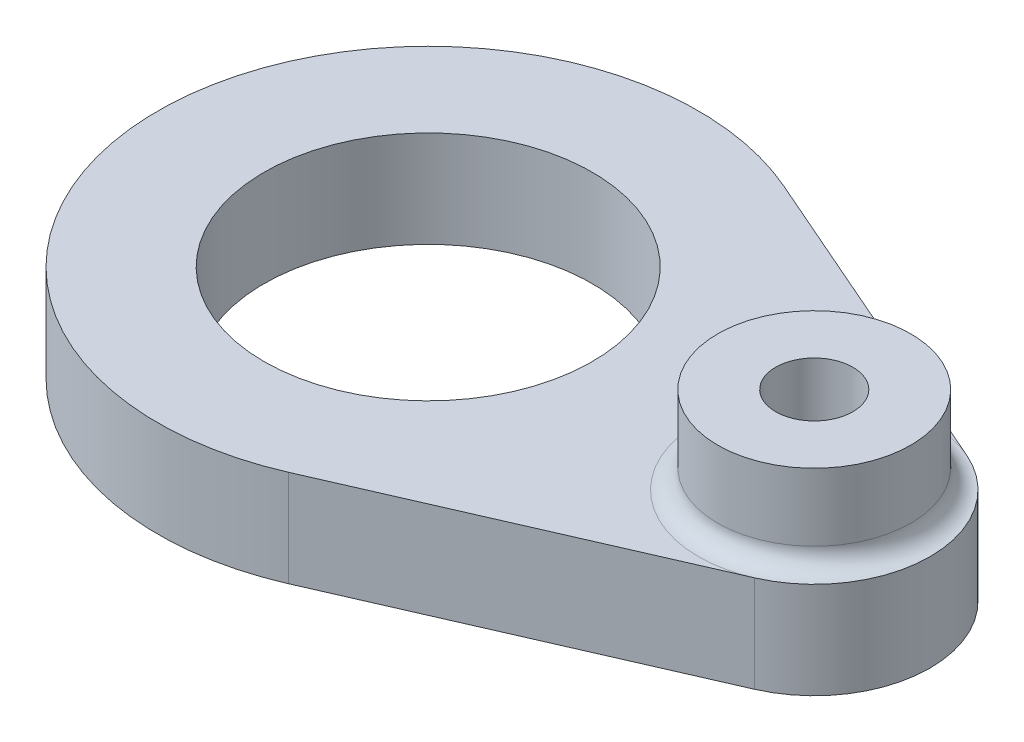
ISO-10303-21;
HEADER;
FILE_DESCRIPTION(('STEP AP214'),'2;1');
FILE_NAME('part.step','',(''),(''),'','','');
FILE_SCHEMA(('AUTOMOTIVE_DESIGN { 1 0 10303 214 1 1 1 1 }'));
ENDSEC;
DATA;
#1=APPLICATION_CONTEXT('core data for automotive mechanical design processes');
#2=APPLICATION_PROTOCOL_DEFINITION('international standard','automotive_design',2000,#1);
#3=PRODUCT_CONTEXT('',#1,'mechanical');
#4=PRODUCT('Part','Part','',(#3));
#5=PRODUCT_RELATED_PRODUCT_CATEGORY('part','',(#4));
#6=PRODUCT_DEFINITION_FORMATION('','',#4);
#7=PRODUCT_DEFINITION_CONTEXT('part definition',#1,'design');
#8=PRODUCT_DEFINITION('design','',#6,#7);
#9=PRODUCT_DEFINITION_SHAPE('','',#8);
#10=(LENGTH_UNIT() NAMED_UNIT(*) SI_UNIT(.MILLI.,.METRE.));
#11=(NAMED_UNIT(*) PLANE_ANGLE_UNIT() SI_UNIT($,.RADIAN.));
#12=(NAMED_UNIT(*) SI_UNIT($,.STERADIAN.) SOLID_ANGLE_UNIT());
#13=UNCERTAINTY_MEASURE_WITH_UNIT(LENGTH_MEASURE(1.E-05),#10,'distance_accuracy_value','');
#14=(GEOMETRIC_REPRESENTATION_CONTEXT(3) GLOBAL_UNCERTAINTY_ASSIGNED_CONTEXT((#13)) GLOBAL_UNIT_ASSIGNED_CONTEXT((#10,
#11,#12)) REPRESENTATION_CONTEXT('',''));
#15=CARTESIAN_POINT('',(0.,0.,0.));
#16=DIRECTION('',(0.,0.,1.));
#17=DIRECTION('',(1.,0.,0.));
#18=AXIS2_PLACEMENT_3D('',#15,#16,#17);
#19=CARTESIAN_POINT('',(0.,2.5,0.));
#20=DIRECTION('',(0.,1.,0.));
#21=DIRECTION('',(0.,0.,1.));
#22=AXIS2_PLACEMENT_3D('',#19,#20,#21);
#23=PLANE('',#22);
#24=DIRECTION('',(0.916515138991168,0.,-0.4));
#25=VECTOR('',#24,1.);
#26=CARTESIAN_POINT('',(2.8,2.5,6.41560597293818));
#27=LINE('',#26,#25);
#28=CARTESIAN_POINT('',(2.8,2.5,6.41560597293818));
#29=VERTEX_POINT('',#28);
#30=CARTESIAN_POINT('',(11.2,2.5,2.7495454169735));
#31=VERTEX_POINT('',#30);
#32=EDGE_CURVE('E85',#29,#31,#27,.T.);
#33=ORIENTED_EDGE('',*,*,#32,.T.);
#34=CARTESIAN_POINT('',(10.,2.5,0.));
#35=DIRECTION('',(0.,1.,0.));
#36=DIRECTION('',(0.,0.,1.));
#37=AXIS2_PLACEMENT_3D('',#34,#35,#36);
#38=CIRCLE('',#37,3.);
#39=CARTESIAN_POINT('',(11.2,2.5,-2.7495454169735));
#40=VERTEX_POINT('',#39);
#41=EDGE_CURVE('E11',#31,#40,#38,.F.);
#42=ORIENTED_EDGE('',*,*,#41,.T.);
#43=DIRECTION('',(0.916515138991168,0.,0.4));
#44=VECTOR('',#43,1.);
#45=CARTESIAN_POINT('',(2.8,2.5,-6.41560597293817));
#46=LINE('',#45,#44);
#47=CARTESIAN_POINT('',(2.8,2.5,-6.41560597293818));
#48=VERTEX_POINT('',#47);
#49=EDGE_CURVE('E108',#48,#40,#46,.T.);
#50=ORIENTED_EDGE('',*,*,#49,.F.);
#51=CARTESIAN_POINT('',(0.,2.5,0.));
#52=DIRECTION('',(0.,1.,0.));
#53=DIRECTION('',(0.,0.,1.));
#54=AXIS2_PLACEMENT_3D('',#51,#52,#53);
#55=CIRCLE('',#54,7.);
#56=EDGE_CURVE('E96',#48,#29,#55,.T.);
#57=ORIENTED_EDGE('',*,*,#56,.T.);
#58=EDGE_LOOP('',(#33,#42,#50,#57));
#59=FACE_BOUND('',#58,.T.);
#60=CARTESIAN_POINT('',(0.,2.5,0.));
#61=DIRECTION('',(0.,1.,0.));
#62=DIRECTION('',(0.,0.,1.));
#63=AXIS2_PLACEMENT_3D('',#60,#61,#62);
#64=CIRCLE('',#63,4.25);
#65=CARTESIAN_POINT('',(0.,2.5,4.25));
#66=VERTEX_POINT('',#65);
#67=EDGE_CURVE('E128',#66,#66,#64,.T.);
#68=ORIENTED_EDGE('',*,*,#67,.F.);
#69=EDGE_LOOP('',(#68));
#70=FACE_BOUND('',#69,.T.);
#71=ADVANCED_FACE('F42',(#59,#70),#23,.T.);
#72=CARTESIAN_POINT('',(0.,2.5,0.));
#73=DIRECTION('',(0.,-1.,0.));
#74=DIRECTION('',(0.,0.,-1.));
#75=AXIS2_PLACEMENT_3D('',#72,#73,#74);
#76=CYLINDRICAL_SURFACE('',#75,7.);
#77=CARTESIAN_POINT('',(0.,0.,0.));
#78=DIRECTION('',(0.,1.,0.));
#79=DIRECTION('',(0.,0.,1.));
#80=AXIS2_PLACEMENT_3D('',#77,#78,#79);
#81=CIRCLE('',#80,7.);
#82=CARTESIAN_POINT('',(2.8,0.,-6.41560597293818));
#83=VERTEX_POINT('',#82);
#84=CARTESIAN_POINT('',(2.8,0.,6.41560597293818));
#85=VERTEX_POINT('',#84);
#86=EDGE_CURVE('E116',#83,#85,#81,.T.);
#87=ORIENTED_EDGE('',*,*,#86,.T.);
#88=DIRECTION('',(0.,-1.,0.));
#89=VECTOR('',#88,1.);
#90=CARTESIAN_POINT('',(2.8,2.5,6.41560597293818));
#91=LINE('',#90,#89);
#92=EDGE_CURVE('E105',#29,#85,#91,.T.);
#93=ORIENTED_EDGE('',*,*,#92,.F.);
#94=ORIENTED_EDGE('',*,*,#56,.F.);
#95=DIRECTION('',(0.,-1.,0.));
#96=VECTOR('',#95,1.);
#97=CARTESIAN_POINT('',(2.8,2.5,-6.41560597293818));
#98=LINE('',#97,#96);
#99=EDGE_CURVE('E59',#48,#83,#98,.T.);
#100=ORIENTED_EDGE('',*,*,#99,.T.);
#101=EDGE_LOOP('',(#87,#93,#94,#100));
#102=FACE_BOUND('',#101,.T.);
#103=ADVANCED_FACE('F143',(#102),#76,.T.);
#104=CARTESIAN_POINT('',(2.8,2.5,6.41560597293818));
#105=DIRECTION('',(-0.4,0.,-0.916515138991168));
#106=DIRECTION('',(-0.916515138991168,0.,0.4));
#107=AXIS2_PLACEMENT_3D('',#104,#105,#106);
#108=PLANE('',#107);
#109=DIRECTION('',(0.916515138991168,0.,-0.4));
#110=VECTOR('',#109,1.);
#111=CARTESIAN_POINT('',(2.8,0.,6.41560597293818));
#112=LINE('',#111,#110);
#113=CARTESIAN_POINT('',(11.2,0.,2.7495454169735));
#114=VERTEX_POINT('',#113);
#115=EDGE_CURVE('E102',#85,#114,#112,.T.);
#116=ORIENTED_EDGE('',*,*,#115,.T.);
#117=DIRECTION('',(0.,-1.,0.));
#118=VECTOR('',#117,1.);
#119=CARTESIAN_POINT('',(11.2,2.5,2.7495454169735));
#120=LINE('',#119,#118);
#121=EDGE_CURVE('E100',#31,#114,#120,.T.);
#122=ORIENTED_EDGE('',*,*,#121,.F.);
#123=ORIENTED_EDGE('',*,*,#32,.F.);
#124=ORIENTED_EDGE('',*,*,#92,.T.);
#125=EDGE_LOOP('',(#116,#122,#123,#124));
#126=FACE_BOUND('',#125,.T.);
#127=ADVANCED_FACE('F101',(#126),#108,.F.);
#128=CARTESIAN_POINT('',(10.,2.5,0.));
#129=DIRECTION('',(0.,-1.,0.));
#130=DIRECTION('',(0.,0.,-1.));
#131=AXIS2_PLACEMENT_3D('',#128,#129,#130);
#132=CYLINDRICAL_SURFACE('',#131,3.);
#133=CARTESIAN_POINT('',(10.,0.,0.));
#134=DIRECTION('',(0.,1.,0.));
#135=DIRECTION('',(0.,0.,1.));
#136=AXIS2_PLACEMENT_3D('',#133,#134,#135);
#137=CIRCLE('',#136,3.);
#138=CARTESIAN_POINT('',(11.2,0.,-2.7495454169735));
#139=VERTEX_POINT('',#138);
#140=EDGE_CURVE('E120',#114,#139,#137,.T.);
#141=ORIENTED_EDGE('',*,*,#140,.T.);
#142=DIRECTION('',(0.,-1.,0.));
#143=VECTOR('',#142,1.);
#144=CARTESIAN_POINT('',(11.2,2.5,-2.7495454169735));
#145=LINE('',#144,#143);
#146=EDGE_CURVE('E73',#40,#139,#145,.T.);
#147=ORIENTED_EDGE('',*,*,#146,.F.);
#148=CARTESIAN_POINT('',(10.,2.5,0.));
#149=DIRECTION('',(0.,1.,0.));
#150=DIRECTION('',(0.,0.,1.));
#151=AXIS2_PLACEMENT_3D('',#148,#149,#150);
#152=CIRCLE('',#151,3.);
#153=EDGE_CURVE('E92',#31,#40,#152,.T.);
#154=ORIENTED_EDGE('',*,*,#153,.F.);
#155=ORIENTED_EDGE('',*,*,#121,.T.);
#156=EDGE_LOOP('',(#141,#147,#154,#155));
#157=FACE_BOUND('',#156,.T.);
#158=ADVANCED_FACE('F107',(#157),#132,.T.);
#159=CARTESIAN_POINT('',(2.8,2.5,-6.41560597293817));
#160=DIRECTION('',(0.4,0.,-0.916515138991168));
#161=DIRECTION('',(-0.916515138991168,0.,-0.4));
#162=AXIS2_PLACEMENT_3D('',#159,#160,#161);
#163=PLANE('',#162);
#164=DIRECTION('',(0.916515138991168,0.,0.4));
#165=VECTOR('',#164,1.);
#166=CARTESIAN_POINT('',(2.8,0.,-6.41560597293817));
#167=LINE('',#166,#165);
#168=EDGE_CURVE('E122',#83,#139,#167,.T.);
#169=ORIENTED_EDGE('',*,*,#168,.F.);
#170=ORIENTED_EDGE('',*,*,#99,.F.);
#171=ORIENTED_EDGE('',*,*,#49,.T.);
#172=ORIENTED_EDGE('',*,*,#146,.T.);
#173=EDGE_LOOP('',(#169,#170,#171,#172));
#174=FACE_BOUND('',#173,.T.);
#175=ADVANCED_FACE('F160',(#174),#163,.T.);
#176=CARTESIAN_POINT('',(0.,2.5,0.));
#177=DIRECTION('',(0.,-1.,0.));
#178=DIRECTION('',(0.,0.,-1.));
#179=AXIS2_PLACEMENT_3D('',#176,#177,#178);
#180=CYLINDRICAL_SURFACE('',#179,4.25);
#181=ORIENTED_EDGE('',*,*,#67,.T.);
#182=EDGE_LOOP('',(#181));
#183=FACE_BOUND('',#182,.T.);
#184=CARTESIAN_POINT('',(0.,0.,0.));
#185=DIRECTION('',(0.,1.,0.));
#186=DIRECTION('',(0.,0.,1.));
#187=AXIS2_PLACEMENT_3D('',#184,#185,#186);
#188=CIRCLE('',#187,4.25);
#189=CARTESIAN_POINT('',(0.,0.,4.25));
#190=VERTEX_POINT('',#189);
#191=EDGE_CURVE('E113',#190,#190,#188,.T.);
#192=ORIENTED_EDGE('',*,*,#191,.F.);
#193=EDGE_LOOP('',(#192));
#194=FACE_BOUND('',#193,.T.);
#195=ADVANCED_FACE('F158',(#183,#194),#180,.F.);
#196=CARTESIAN_POINT('',(10.,2.5,0.));
#197=DIRECTION('',(0.,-1.,0.));
#198=DIRECTION('',(0.,0.,-1.));
#199=AXIS2_PLACEMENT_3D('',#196,#197,#198);
#200=CYLINDRICAL_SURFACE('',#199,1.);
#201=CARTESIAN_POINT('',(10.,0.,0.));
#202=DIRECTION('',(0.,1.,0.));
#203=DIRECTION('',(0.,0.,1.));
#204=AXIS2_PLACEMENT_3D('',#201,#202,#203);
#205=CIRCLE('',#204,1.);
#206=CARTESIAN_POINT('',(10.,0.,1.));
#207=VERTEX_POINT('',#206);
#208=EDGE_CURVE('E125',#207,#207,#205,.T.);
#209=ORIENTED_EDGE('',*,*,#208,.F.);
#210=EDGE_LOOP('',(#209));
#211=FACE_BOUND('',#210,.T.);
#212=CARTESIAN_POINT('',(10.,4.75,0.));
#213=DIRECTION('',(0.,1.,0.));
#214=DIRECTION('',(0.,0.,1.));
#215=AXIS2_PLACEMENT_3D('',#212,#213,#214);
#216=CIRCLE('',#215,1.);
#217=CARTESIAN_POINT('',(10.,4.75,1.));
#218=VERTEX_POINT('',#217);
#219=EDGE_CURVE('E180',#218,#218,#216,.T.);
#220=ORIENTED_EDGE('',*,*,#219,.T.);
#221=EDGE_LOOP('',(#220));
#222=FACE_BOUND('',#221,.T.);
#223=ADVANCED_FACE('F154',(#211,#222),#200,.F.);
#224=CARTESIAN_POINT('',(0.,0.,0.));
#225=DIRECTION('',(0.,1.,0.));
#226=DIRECTION('',(0.,0.,1.));
#227=AXIS2_PLACEMENT_3D('',#224,#225,#226);
#228=PLANE('',#227);
#229=ORIENTED_EDGE('',*,*,#191,.T.);
#230=EDGE_LOOP('',(#229));
#231=FACE_BOUND('',#230,.T.);
#232=ORIENTED_EDGE('',*,*,#86,.F.);
#233=ORIENTED_EDGE('',*,*,#168,.T.);
#234=ORIENTED_EDGE('',*,*,#140,.F.);
#235=ORIENTED_EDGE('',*,*,#115,.F.);
#236=EDGE_LOOP('',(#232,#233,#234,#235));
#237=FACE_BOUND('',#236,.T.);
#238=ORIENTED_EDGE('',*,*,#208,.T.);
#239=EDGE_LOOP('',(#238));
#240=FACE_BOUND('',#239,.T.);
#241=ADVANCED_FACE('F151',(#231,#237,#240),#228,.F.);
#242=CARTESIAN_POINT('',(10.,4.75,0.));
#243=DIRECTION('',(0.,1.,0.));
#244=DIRECTION('',(0.,0.,1.));
#245=AXIS2_PLACEMENT_3D('',#242,#243,#244);
#246=PLANE('',#245);
#247=CARTESIAN_POINT('',(10.,4.75,0.));
#248=DIRECTION('',(0.,1.,0.));
#249=DIRECTION('',(0.,0.,1.));
#250=AXIS2_PLACEMENT_3D('',#247,#248,#249);
#251=CIRCLE('',#250,2.5);
#252=CARTESIAN_POINT('',(10.,4.75,2.5));
#253=VERTEX_POINT('',#252);
#254=EDGE_CURVE('E117',#253,#253,#251,.T.);
#255=ORIENTED_EDGE('',*,*,#254,.T.);
#256=EDGE_LOOP('',(#255));
#257=FACE_BOUND('',#256,.T.);
#258=ORIENTED_EDGE('',*,*,#219,.F.);
#259=EDGE_LOOP('',(#258));
#260=FACE_BOUND('',#259,.T.);
#261=ADVANCED_FACE('F140',(#257,#260),#246,.T.);
#262=CARTESIAN_POINT('',(10.,4.75,0.));
#263=DIRECTION('',(0.,-1.,0.));
#264=DIRECTION('',(0.,0.,-1.));
#265=AXIS2_PLACEMENT_3D('',#262,#263,#264);
#266=CYLINDRICAL_SURFACE('',#265,2.5);
#267=CARTESIAN_POINT('',(10.,3.,0.));
#268=DIRECTION('',(0.,1.,0.));
#269=DIRECTION('',(0.,0.,1.));
#270=AXIS2_PLACEMENT_3D('',#267,#268,#269);
#271=CIRCLE('',#270,2.5);
#272=CARTESIAN_POINT('',(10.,3.,2.5));
#273=VERTEX_POINT('',#272);
#274=EDGE_CURVE('E51',#273,#273,#271,.T.);
#275=ORIENTED_EDGE('',*,*,#274,.T.);
#276=EDGE_LOOP('',(#275));
#277=FACE_BOUND('',#276,.T.);
#278=ORIENTED_EDGE('',*,*,#254,.F.);
#279=EDGE_LOOP('',(#278));
#280=FACE_BOUND('',#279,.T.);
#281=ADVANCED_FACE('F134',(#277,#280),#266,.T.);
#282=CARTESIAN_POINT('',(10.,3.,0.));
#283=DIRECTION('',(0.,1.,0.));
#284=DIRECTION('',(0.,0.,1.));
#285=AXIS2_PLACEMENT_3D('',#282,#283,#284);
#286=TOROIDAL_SURFACE('',#285,3.,0.5);
#287=ORIENTED_EDGE('',*,*,#41,.F.);
#288=ORIENTED_EDGE('',*,*,#153,.T.);
#289=EDGE_LOOP('',(#287,#288));
#290=FACE_BOUND('',#289,.T.);
#291=ORIENTED_EDGE('',*,*,#274,.F.);
#292=EDGE_LOOP('',(#291));
#293=FACE_BOUND('',#292,.T.);
#294=ADVANCED_FACE('F44',(#290,#293),#286,.F.);
#295=CLOSED_SHELL('',(#71,#103,#127,#158,#175,#195,#223,#241,#261,#281,#294));
#296=MANIFOLD_SOLID_BREP('B2',#295);
#297=ADVANCED_BREP_SHAPE_REPRESENTATION('',(#18,#296),#14);
#298=SHAPE_DEFINITION_REPRESENTATION(#9,#297);
ENDSEC;
END-ISO-10303-21;
